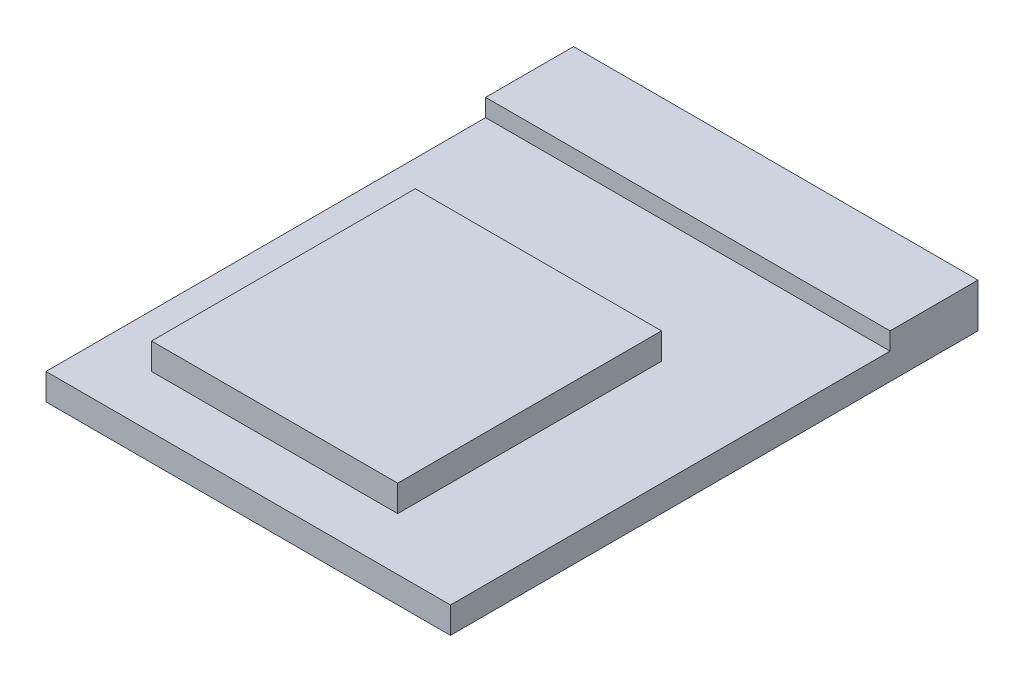
ISO-10303-21;
HEADER;
FILE_DESCRIPTION(('STEP AP214'),'2;1');
FILE_NAME('part.step','',(''),(''),'','','');
FILE_SCHEMA(('AUTOMOTIVE_DESIGN { 1 0 10303 214 1 1 1 1 }'));
ENDSEC;
DATA;
#1=APPLICATION_CONTEXT('core data for automotive mechanical design processes');
#2=APPLICATION_PROTOCOL_DEFINITION('international standard','automotive_design',2000,#1);
#3=PRODUCT_CONTEXT('',#1,'mechanical');
#4=PRODUCT('Part','Part','',(#3));
#5=PRODUCT_RELATED_PRODUCT_CATEGORY('part','',(#4));
#6=PRODUCT_DEFINITION_FORMATION('','',#4);
#7=PRODUCT_DEFINITION_CONTEXT('part definition',#1,'design');
#8=PRODUCT_DEFINITION('design','',#6,#7);
#9=PRODUCT_DEFINITION_SHAPE('','',#8);
#10=(LENGTH_UNIT() NAMED_UNIT(*) SI_UNIT(.MILLI.,.METRE.));
#11=(NAMED_UNIT(*) PLANE_ANGLE_UNIT() SI_UNIT($,.RADIAN.));
#12=(NAMED_UNIT(*) SI_UNIT($,.STERADIAN.) SOLID_ANGLE_UNIT());
#13=UNCERTAINTY_MEASURE_WITH_UNIT(LENGTH_MEASURE(1.E-05),#10,'distance_accuracy_value','');
#14=(GEOMETRIC_REPRESENTATION_CONTEXT(3) GLOBAL_UNCERTAINTY_ASSIGNED_CONTEXT((#13)) GLOBAL_UNIT_ASSIGNED_CONTEXT((#10,
#11,#12)) REPRESENTATION_CONTEXT('',''));
#15=CARTESIAN_POINT('',(0.,0.,0.));
#16=DIRECTION('',(0.,0.,1.));
#17=DIRECTION('',(1.,0.,0.));
#18=AXIS2_PLACEMENT_3D('',#15,#16,#17);
#19=CARTESIAN_POINT('',(0.,1.5,0.));
#20=DIRECTION('',(0.,1.,0.));
#21=DIRECTION('',(0.,0.,1.));
#22=AXIS2_PLACEMENT_3D('',#19,#20,#21);
#23=PLANE('',#22);
#24=DIRECTION('',(0.,0.,1.));
#25=VECTOR('',#24,1.);
#26=CARTESIAN_POINT('',(3.,1.5,12.));
#27=LINE('',#26,#25);
#28=CARTESIAN_POINT('',(3.,1.5,12.));
#29=VERTEX_POINT('',#28);
#30=CARTESIAN_POINT('',(3.,1.5,27.));
#31=VERTEX_POINT('',#30);
#32=EDGE_CURVE('E64',#29,#31,#27,.T.);
#33=ORIENTED_EDGE('',*,*,#32,.F.);
#34=DIRECTION('',(-1.,0.,0.));
#35=VECTOR('',#34,1.);
#36=CARTESIAN_POINT('',(3.,1.5,12.));
#37=LINE('',#36,#35);
#38=CARTESIAN_POINT('',(17.,1.5,12.));
#39=VERTEX_POINT('',#38);
#40=EDGE_CURVE('E153',#39,#29,#37,.T.);
#41=ORIENTED_EDGE('',*,*,#40,.F.);
#42=DIRECTION('',(0.,0.,-1.));
#43=VECTOR('',#42,1.);
#44=CARTESIAN_POINT('',(17.,1.5,12.));
#45=LINE('',#44,#43);
#46=CARTESIAN_POINT('',(17.,1.5,27.));
#47=VERTEX_POINT('',#46);
#48=EDGE_CURVE('E164',#47,#39,#45,.T.);
#49=ORIENTED_EDGE('',*,*,#48,.F.);
#50=DIRECTION('',(1.,0.,0.));
#51=VECTOR('',#50,1.);
#52=CARTESIAN_POINT('',(3.,1.5,27.));
#53=LINE('',#52,#51);
#54=EDGE_CURVE('E161',#31,#47,#53,.T.);
#55=ORIENTED_EDGE('',*,*,#54,.F.);
#56=EDGE_LOOP('',(#33,#41,#49,#55));
#57=FACE_BOUND('',#56,.T.);
#58=DIRECTION('',(0.,0.,-1.));
#59=VECTOR('',#58,1.);
#60=CARTESIAN_POINT('',(23.,1.5,0.));
#61=LINE('',#60,#59);
#62=CARTESIAN_POINT('',(23.,1.5,30.));
#63=VERTEX_POINT('',#62);
#64=CARTESIAN_POINT('',(23.,1.5,5.));
#65=VERTEX_POINT('',#64);
#66=EDGE_CURVE('E56',#63,#65,#61,.T.);
#67=ORIENTED_EDGE('',*,*,#66,.T.);
#68=DIRECTION('',(1.,0.,0.));
#69=VECTOR('',#68,1.);
#70=CARTESIAN_POINT('',(0.,1.5,5.));
#71=LINE('',#70,#69);
#72=CARTESIAN_POINT('',(0.,1.5,5.));
#73=VERTEX_POINT('',#72);
#74=EDGE_CURVE('E131',#73,#65,#71,.T.);
#75=ORIENTED_EDGE('',*,*,#74,.F.);
#76=DIRECTION('',(0.,0.,1.));
#77=VECTOR('',#76,1.);
#78=CARTESIAN_POINT('',(0.,1.5,0.));
#79=LINE('',#78,#77);
#80=CARTESIAN_POINT('',(0.,1.5,30.));
#81=VERTEX_POINT('',#80);
#82=EDGE_CURVE('E180',#73,#81,#79,.T.);
#83=ORIENTED_EDGE('',*,*,#82,.T.);
#84=DIRECTION('',(1.,0.,0.));
#85=VECTOR('',#84,1.);
#86=CARTESIAN_POINT('',(0.,1.5,30.));
#87=LINE('',#86,#85);
#88=EDGE_CURVE('E182',#81,#63,#87,.T.);
#89=ORIENTED_EDGE('',*,*,#88,.T.);
#90=EDGE_LOOP('',(#67,#75,#83,#89));
#91=FACE_BOUND('',#90,.T.);
#92=ADVANCED_FACE('F41',(#57,#91),#23,.T.);
#93=CARTESIAN_POINT('',(0.,1.5,0.));
#94=DIRECTION('',(1.,0.,0.));
#95=DIRECTION('',(0.,0.,-1.));
#96=AXIS2_PLACEMENT_3D('',#93,#94,#95);
#97=PLANE('',#96);
#98=DIRECTION('',(0.,0.,1.));
#99=VECTOR('',#98,1.);
#100=CARTESIAN_POINT('',(0.,0.,0.));
#101=LINE('',#100,#99);
#102=CARTESIAN_POINT('',(0.,0.,0.));
#103=VERTEX_POINT('',#102);
#104=CARTESIAN_POINT('',(0.,0.,30.));
#105=VERTEX_POINT('',#104);
#106=EDGE_CURVE('E179',#103,#105,#101,.T.);
#107=ORIENTED_EDGE('',*,*,#106,.T.);
#108=DIRECTION('',(0.,-1.,0.));
#109=VECTOR('',#108,1.);
#110=CARTESIAN_POINT('',(0.,1.5,30.));
#111=LINE('',#110,#109);
#112=EDGE_CURVE('E11',#81,#105,#111,.T.);
#113=ORIENTED_EDGE('',*,*,#112,.F.);
#114=ORIENTED_EDGE('',*,*,#82,.F.);
#115=DIRECTION('',(0.,-1.,0.));
#116=VECTOR('',#115,1.);
#117=CARTESIAN_POINT('',(0.,2.5,5.));
#118=LINE('',#117,#116);
#119=CARTESIAN_POINT('',(0.,2.5,5.));
#120=VERTEX_POINT('',#119);
#121=EDGE_CURVE('E137',#120,#73,#118,.T.);
#122=ORIENTED_EDGE('',*,*,#121,.F.);
#123=DIRECTION('',(0.,0.,1.));
#124=VECTOR('',#123,1.);
#125=CARTESIAN_POINT('',(0.,2.5,0.));
#126=LINE('',#125,#124);
#127=CARTESIAN_POINT('',(0.,2.5,0.));
#128=VERTEX_POINT('',#127);
#129=EDGE_CURVE('E127',#128,#120,#126,.T.);
#130=ORIENTED_EDGE('',*,*,#129,.F.);
#131=DIRECTION('',(0.,-1.,0.));
#132=VECTOR('',#131,1.);
#133=CARTESIAN_POINT('',(0.,1.5,0.));
#134=LINE('',#133,#132);
#135=EDGE_CURVE('E186',#128,#103,#134,.T.);
#136=ORIENTED_EDGE('',*,*,#135,.T.);
#137=EDGE_LOOP('',(#107,#113,#114,#122,#130,#136));
#138=FACE_BOUND('',#137,.T.);
#139=ADVANCED_FACE('F43',(#138),#97,.F.);
#140=CARTESIAN_POINT('',(0.,1.5,30.));
#141=DIRECTION('',(0.,0.,-1.));
#142=DIRECTION('',(-1.,0.,0.));
#143=AXIS2_PLACEMENT_3D('',#140,#141,#142);
#144=PLANE('',#143);
#145=DIRECTION('',(1.,0.,0.));
#146=VECTOR('',#145,1.);
#147=CARTESIAN_POINT('',(0.,0.,30.));
#148=LINE('',#147,#146);
#149=CARTESIAN_POINT('',(23.,0.,30.));
#150=VERTEX_POINT('',#149);
#151=EDGE_CURVE('E189',#105,#150,#148,.T.);
#152=ORIENTED_EDGE('',*,*,#151,.T.);
#153=DIRECTION('',(0.,-1.,0.));
#154=VECTOR('',#153,1.);
#155=CARTESIAN_POINT('',(23.,1.5,30.));
#156=LINE('',#155,#154);
#157=EDGE_CURVE('E49',#63,#150,#156,.T.);
#158=ORIENTED_EDGE('',*,*,#157,.F.);
#159=ORIENTED_EDGE('',*,*,#88,.F.);
#160=ORIENTED_EDGE('',*,*,#112,.T.);
#161=EDGE_LOOP('',(#152,#158,#159,#160));
#162=FACE_BOUND('',#161,.T.);
#163=ADVANCED_FACE('F215',(#162),#144,.F.);
#164=CARTESIAN_POINT('',(23.,1.5,0.));
#165=DIRECTION('',(-1.,0.,0.));
#166=DIRECTION('',(0.,0.,1.));
#167=AXIS2_PLACEMENT_3D('',#164,#165,#166);
#168=PLANE('',#167);
#169=DIRECTION('',(0.,0.,-1.));
#170=VECTOR('',#169,1.);
#171=CARTESIAN_POINT('',(23.,0.,0.));
#172=LINE('',#171,#170);
#173=CARTESIAN_POINT('',(23.,0.,0.));
#174=VERTEX_POINT('',#173);
#175=EDGE_CURVE('E191',#150,#174,#172,.T.);
#176=ORIENTED_EDGE('',*,*,#175,.T.);
#177=DIRECTION('',(0.,-1.,0.));
#178=VECTOR('',#177,1.);
#179=CARTESIAN_POINT('',(23.,1.5,0.));
#180=LINE('',#179,#178);
#181=CARTESIAN_POINT('',(23.,2.5,0.));
#182=VERTEX_POINT('',#181);
#183=EDGE_CURVE('E141',#182,#174,#180,.T.);
#184=ORIENTED_EDGE('',*,*,#183,.F.);
#185=DIRECTION('',(0.,0.,1.));
#186=VECTOR('',#185,1.);
#187=CARTESIAN_POINT('',(23.,2.5,0.));
#188=LINE('',#187,#186);
#189=CARTESIAN_POINT('',(23.,2.5,5.));
#190=VERTEX_POINT('',#189);
#191=EDGE_CURVE('E124',#182,#190,#188,.T.);
#192=ORIENTED_EDGE('',*,*,#191,.T.);
#193=DIRECTION('',(0.,-1.,0.));
#194=VECTOR('',#193,1.);
#195=CARTESIAN_POINT('',(23.,2.5,5.));
#196=LINE('',#195,#194);
#197=EDGE_CURVE('E134',#190,#65,#196,.T.);
#198=ORIENTED_EDGE('',*,*,#197,.T.);
#199=ORIENTED_EDGE('',*,*,#66,.F.);
#200=ORIENTED_EDGE('',*,*,#157,.T.);
#201=EDGE_LOOP('',(#176,#184,#192,#198,#199,#200));
#202=FACE_BOUND('',#201,.T.);
#203=ADVANCED_FACE('F139',(#202),#168,.F.);
#204=CARTESIAN_POINT('',(0.,1.5,0.));
#205=DIRECTION('',(0.,0.,1.));
#206=DIRECTION('',(1.,0.,0.));
#207=AXIS2_PLACEMENT_3D('',#204,#205,#206);
#208=PLANE('',#207);
#209=DIRECTION('',(-1.,0.,0.));
#210=VECTOR('',#209,1.);
#211=CARTESIAN_POINT('',(0.,0.,0.));
#212=LINE('',#211,#210);
#213=EDGE_CURVE('E183',#174,#103,#212,.T.);
#214=ORIENTED_EDGE('',*,*,#213,.T.);
#215=ORIENTED_EDGE('',*,*,#135,.F.);
#216=DIRECTION('',(1.,0.,0.));
#217=VECTOR('',#216,1.);
#218=CARTESIAN_POINT('',(0.,2.5,0.));
#219=LINE('',#218,#217);
#220=EDGE_CURVE('E142',#128,#182,#219,.T.);
#221=ORIENTED_EDGE('',*,*,#220,.T.);
#222=ORIENTED_EDGE('',*,*,#183,.T.);
#223=EDGE_LOOP('',(#214,#215,#221,#222));
#224=FACE_BOUND('',#223,.T.);
#225=ADVANCED_FACE('F206',(#224),#208,.F.);
#226=CARTESIAN_POINT('',(0.,0.,0.));
#227=DIRECTION('',(0.,1.,0.));
#228=DIRECTION('',(0.,0.,1.));
#229=AXIS2_PLACEMENT_3D('',#226,#227,#228);
#230=PLANE('',#229);
#231=ORIENTED_EDGE('',*,*,#106,.F.);
#232=ORIENTED_EDGE('',*,*,#213,.F.);
#233=ORIENTED_EDGE('',*,*,#175,.F.);
#234=ORIENTED_EDGE('',*,*,#151,.F.);
#235=EDGE_LOOP('',(#231,#232,#233,#234));
#236=FACE_BOUND('',#235,.T.);
#237=ADVANCED_FACE('F204',(#236),#230,.F.);
#238=CARTESIAN_POINT('',(3.,3.,12.));
#239=DIRECTION('',(1.,0.,0.));
#240=DIRECTION('',(0.,0.,-1.));
#241=AXIS2_PLACEMENT_3D('',#238,#239,#240);
#242=PLANE('',#241);
#243=ORIENTED_EDGE('',*,*,#32,.T.);
#244=DIRECTION('',(0.,-1.,0.));
#245=VECTOR('',#244,1.);
#246=CARTESIAN_POINT('',(3.,3.,27.));
#247=LINE('',#246,#245);
#248=CARTESIAN_POINT('',(3.,3.,27.));
#249=VERTEX_POINT('',#248);
#250=EDGE_CURVE('E176',#249,#31,#247,.T.);
#251=ORIENTED_EDGE('',*,*,#250,.F.);
#252=DIRECTION('',(0.,0.,1.));
#253=VECTOR('',#252,1.);
#254=CARTESIAN_POINT('',(3.,3.,12.));
#255=LINE('',#254,#253);
#256=CARTESIAN_POINT('',(3.,3.,12.));
#257=VERTEX_POINT('',#256);
#258=EDGE_CURVE('E149',#257,#249,#255,.T.);
#259=ORIENTED_EDGE('',*,*,#258,.F.);
#260=DIRECTION('',(0.,-1.,0.));
#261=VECTOR('',#260,1.);
#262=CARTESIAN_POINT('',(3.,3.,12.));
#263=LINE('',#262,#261);
#264=EDGE_CURVE('E159',#257,#29,#263,.T.);
#265=ORIENTED_EDGE('',*,*,#264,.T.);
#266=EDGE_LOOP('',(#243,#251,#259,#265));
#267=FACE_BOUND('',#266,.T.);
#268=ADVANCED_FACE('F218',(#267),#242,.F.);
#269=CARTESIAN_POINT('',(3.,3.,27.));
#270=DIRECTION('',(0.,0.,-1.));
#271=DIRECTION('',(-1.,0.,0.));
#272=AXIS2_PLACEMENT_3D('',#269,#270,#271);
#273=PLANE('',#272);
#274=ORIENTED_EDGE('',*,*,#54,.T.);
#275=DIRECTION('',(0.,-1.,0.));
#276=VECTOR('',#275,1.);
#277=CARTESIAN_POINT('',(17.,3.,27.));
#278=LINE('',#277,#276);
#279=CARTESIAN_POINT('',(17.,3.,27.));
#280=VERTEX_POINT('',#279);
#281=EDGE_CURVE('E173',#280,#47,#278,.T.);
#282=ORIENTED_EDGE('',*,*,#281,.F.);
#283=DIRECTION('',(1.,0.,0.));
#284=VECTOR('',#283,1.);
#285=CARTESIAN_POINT('',(3.,3.,27.));
#286=LINE('',#285,#284);
#287=EDGE_CURVE('E152',#249,#280,#286,.T.);
#288=ORIENTED_EDGE('',*,*,#287,.F.);
#289=ORIENTED_EDGE('',*,*,#250,.T.);
#290=EDGE_LOOP('',(#274,#282,#288,#289));
#291=FACE_BOUND('',#290,.T.);
#292=ADVANCED_FACE('F243',(#291),#273,.F.);
#293=CARTESIAN_POINT('',(17.,3.,12.));
#294=DIRECTION('',(-1.,0.,0.));
#295=DIRECTION('',(0.,0.,1.));
#296=AXIS2_PLACEMENT_3D('',#293,#294,#295);
#297=PLANE('',#296);
#298=ORIENTED_EDGE('',*,*,#48,.T.);
#299=DIRECTION('',(0.,-1.,0.));
#300=VECTOR('',#299,1.);
#301=CARTESIAN_POINT('',(17.,3.,12.));
#302=LINE('',#301,#300);
#303=CARTESIAN_POINT('',(17.,3.,12.));
#304=VERTEX_POINT('',#303);
#305=EDGE_CURVE('E170',#304,#39,#302,.T.);
#306=ORIENTED_EDGE('',*,*,#305,.F.);
#307=DIRECTION('',(0.,0.,-1.));
#308=VECTOR('',#307,1.);
#309=CARTESIAN_POINT('',(17.,3.,12.));
#310=LINE('',#309,#308);
#311=EDGE_CURVE('E155',#280,#304,#310,.T.);
#312=ORIENTED_EDGE('',*,*,#311,.F.);
#313=ORIENTED_EDGE('',*,*,#281,.T.);
#314=EDGE_LOOP('',(#298,#306,#312,#313));
#315=FACE_BOUND('',#314,.T.);
#316=ADVANCED_FACE('F251',(#315),#297,.F.);
#317=CARTESIAN_POINT('',(3.,3.,12.));
#318=DIRECTION('',(0.,0.,1.));
#319=DIRECTION('',(1.,0.,0.));
#320=AXIS2_PLACEMENT_3D('',#317,#318,#319);
#321=PLANE('',#320);
#322=ORIENTED_EDGE('',*,*,#40,.T.);
#323=ORIENTED_EDGE('',*,*,#264,.F.);
#324=DIRECTION('',(-1.,0.,0.));
#325=VECTOR('',#324,1.);
#326=CARTESIAN_POINT('',(3.,3.,12.));
#327=LINE('',#326,#325);
#328=EDGE_CURVE('E157',#304,#257,#327,.T.);
#329=ORIENTED_EDGE('',*,*,#328,.F.);
#330=ORIENTED_EDGE('',*,*,#305,.T.);
#331=EDGE_LOOP('',(#322,#323,#329,#330));
#332=FACE_BOUND('',#331,.T.);
#333=ADVANCED_FACE('F259',(#332),#321,.F.);
#334=CARTESIAN_POINT('',(0.,3.,0.));
#335=DIRECTION('',(0.,1.,0.));
#336=DIRECTION('',(0.,0.,1.));
#337=AXIS2_PLACEMENT_3D('',#334,#335,#336);
#338=PLANE('',#337);
#339=ORIENTED_EDGE('',*,*,#258,.T.);
#340=ORIENTED_EDGE('',*,*,#287,.T.);
#341=ORIENTED_EDGE('',*,*,#311,.T.);
#342=ORIENTED_EDGE('',*,*,#328,.T.);
#343=EDGE_LOOP('',(#339,#340,#341,#342));
#344=FACE_BOUND('',#343,.T.);
#345=ADVANCED_FACE('F267',(#344),#338,.T.);
#346=CARTESIAN_POINT('',(0.,2.5,5.));
#347=DIRECTION('',(0.,0.,-1.));
#348=DIRECTION('',(-1.,0.,0.));
#349=AXIS2_PLACEMENT_3D('',#346,#347,#348);
#350=PLANE('',#349);
#351=ORIENTED_EDGE('',*,*,#74,.T.);
#352=ORIENTED_EDGE('',*,*,#197,.F.);
#353=DIRECTION('',(1.,0.,0.));
#354=VECTOR('',#353,1.);
#355=CARTESIAN_POINT('',(0.,2.5,5.));
#356=LINE('',#355,#354);
#357=EDGE_CURVE('E119',#120,#190,#356,.T.);
#358=ORIENTED_EDGE('',*,*,#357,.F.);
#359=ORIENTED_EDGE('',*,*,#121,.T.);
#360=EDGE_LOOP('',(#351,#352,#358,#359));
#361=FACE_BOUND('',#360,.T.);
#362=ADVANCED_FACE('F135',(#361),#350,.F.);
#363=CARTESIAN_POINT('',(0.,2.5,0.));
#364=DIRECTION('',(0.,-1.,0.));
#365=DIRECTION('',(0.,0.,-1.));
#366=AXIS2_PLACEMENT_3D('',#363,#364,#365);
#367=PLANE('',#366);
#368=ORIENTED_EDGE('',*,*,#357,.T.);
#369=ORIENTED_EDGE('',*,*,#191,.F.);
#370=ORIENTED_EDGE('',*,*,#220,.F.);
#371=ORIENTED_EDGE('',*,*,#129,.T.);
#372=EDGE_LOOP('',(#368,#369,#370,#371));
#373=FACE_BOUND('',#372,.T.);
#374=ADVANCED_FACE('F121',(#373),#367,.F.);
#375=CLOSED_SHELL('',(#92,#139,#163,#203,#225,#237,#268,#292,#316,#333,#345,#362,#374));
#376=MANIFOLD_SOLID_BREP('B2',#375);
#377=ADVANCED_BREP_SHAPE_REPRESENTATION('',(#18,#376),#14);
#378=SHAPE_DEFINITION_REPRESENTATION(#9,#377);
ENDSEC;
END-ISO-10303-21;
